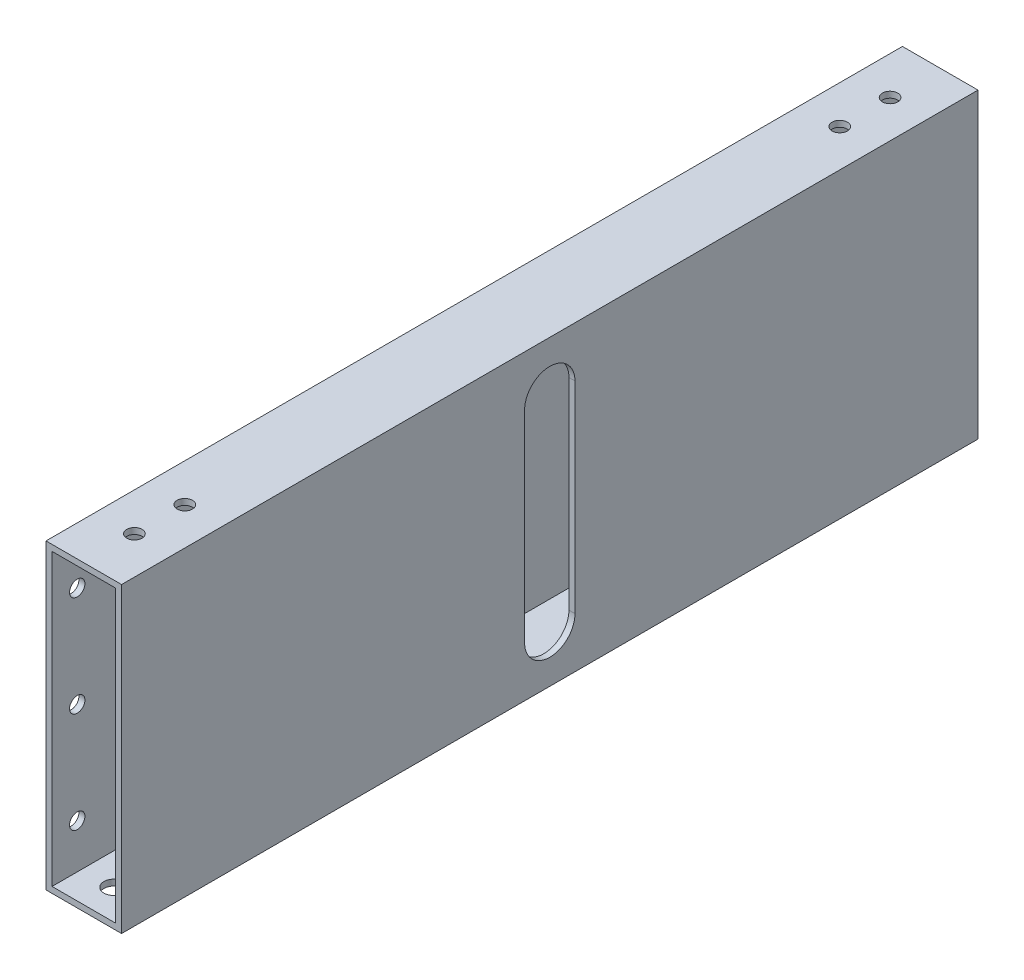
ISO-10303-21;
HEADER;
FILE_DESCRIPTION(('STEP AP214'),'2;1');
FILE_NAME('part.step','',(''),(''),'','','');
FILE_SCHEMA(('AUTOMOTIVE_DESIGN { 1 0 10303 214 1 1 1 1 }'));
ENDSEC;
DATA;
#1=APPLICATION_CONTEXT('core data for automotive mechanical design processes');
#2=APPLICATION_PROTOCOL_DEFINITION('international standard','automotive_design',2000,#1);
#3=PRODUCT_CONTEXT('',#1,'mechanical');
#4=PRODUCT('Part','Part','',(#3));
#5=PRODUCT_RELATED_PRODUCT_CATEGORY('part','',(#4));
#6=PRODUCT_DEFINITION_FORMATION('','',#4);
#7=PRODUCT_DEFINITION_CONTEXT('part definition',#1,'design');
#8=PRODUCT_DEFINITION('design','',#6,#7);
#9=PRODUCT_DEFINITION_SHAPE('','',#8);
#10=(LENGTH_UNIT() NAMED_UNIT(*) SI_UNIT(.MILLI.,.METRE.));
#11=(NAMED_UNIT(*) PLANE_ANGLE_UNIT() SI_UNIT($,.RADIAN.));
#12=(NAMED_UNIT(*) SI_UNIT($,.STERADIAN.) SOLID_ANGLE_UNIT());
#13=UNCERTAINTY_MEASURE_WITH_UNIT(LENGTH_MEASURE(1.E-05),#10,'distance_accuracy_value','');
#14=(GEOMETRIC_REPRESENTATION_CONTEXT(3) GLOBAL_UNCERTAINTY_ASSIGNED_CONTEXT((#13)) GLOBAL_UNIT_ASSIGNED_CONTEXT((#10,
#11,#12)) REPRESENTATION_CONTEXT('',''));
#15=CARTESIAN_POINT('',(0.,0.,0.));
#16=DIRECTION('',(0.,0.,1.));
#17=DIRECTION('',(1.,0.,0.));
#18=AXIS2_PLACEMENT_3D('',#15,#16,#17);
#19=CARTESIAN_POINT('',(0.,0.,85.));
#20=DIRECTION('',(0.,0.,-1.));
#21=DIRECTION('',(-1.,0.,0.));
#22=AXIS2_PLACEMENT_3D('',#19,#20,#21);
#23=PLANE('',#22);
#24=DIRECTION('',(0.,1.,0.));
#25=VECTOR('',#24,1.);
#26=CARTESIAN_POINT('',(7.5,-30.,85.));
#27=LINE('',#26,#25);
#28=CARTESIAN_POINT('',(7.5,-30.,85.));
#29=VERTEX_POINT('',#28);
#30=CARTESIAN_POINT('',(7.5,30.,85.));
#31=VERTEX_POINT('',#30);
#32=EDGE_CURVE('E274',#29,#31,#27,.T.);
#33=ORIENTED_EDGE('',*,*,#32,.T.);
#34=DIRECTION('',(-1.,0.,0.));
#35=VECTOR('',#34,1.);
#36=CARTESIAN_POINT('',(-7.5,30.,85.));
#37=LINE('',#36,#35);
#38=CARTESIAN_POINT('',(-7.5,30.,85.));
#39=VERTEX_POINT('',#38);
#40=EDGE_CURVE('E277',#31,#39,#37,.T.);
#41=ORIENTED_EDGE('',*,*,#40,.T.);
#42=DIRECTION('',(0.,-1.,0.));
#43=VECTOR('',#42,1.);
#44=CARTESIAN_POINT('',(-7.5,-30.,85.));
#45=LINE('',#44,#43);
#46=CARTESIAN_POINT('',(-7.5,-30.,85.));
#47=VERTEX_POINT('',#46);
#48=EDGE_CURVE('E280',#39,#47,#45,.T.);
#49=ORIENTED_EDGE('',*,*,#48,.T.);
#50=DIRECTION('',(1.,0.,0.));
#51=VECTOR('',#50,1.);
#52=CARTESIAN_POINT('',(-7.5,-30.,85.));
#53=LINE('',#52,#51);
#54=EDGE_CURVE('E282',#47,#29,#53,.T.);
#55=ORIENTED_EDGE('',*,*,#54,.T.);
#56=EDGE_LOOP('',(#33,#41,#49,#55));
#57=FACE_BOUND('',#56,.T.);
#58=DIRECTION('',(1.,0.,0.));
#59=VECTOR('',#58,1.);
#60=CARTESIAN_POINT('',(-6.3,-28.8,85.));
#61=LINE('',#60,#59);
#62=CARTESIAN_POINT('',(-6.3,-28.8,85.));
#63=VERTEX_POINT('',#62);
#64=CARTESIAN_POINT('',(6.30000000000001,-28.8,85.));
#65=VERTEX_POINT('',#64);
#66=EDGE_CURVE('E243',#63,#65,#61,.T.);
#67=ORIENTED_EDGE('',*,*,#66,.F.);
#68=DIRECTION('',(0.,-1.,0.));
#69=VECTOR('',#68,1.);
#70=CARTESIAN_POINT('',(-6.3,-28.8,85.));
#71=LINE('',#70,#69);
#72=CARTESIAN_POINT('',(-6.3,28.8,85.));
#73=VERTEX_POINT('',#72);
#74=EDGE_CURVE('E251',#73,#63,#71,.T.);
#75=ORIENTED_EDGE('',*,*,#74,.F.);
#76=DIRECTION('',(-1.,0.,0.));
#77=VECTOR('',#76,1.);
#78=CARTESIAN_POINT('',(-6.3,28.8,85.));
#79=LINE('',#78,#77);
#80=CARTESIAN_POINT('',(6.30000000000001,28.8,85.));
#81=VERTEX_POINT('',#80);
#82=EDGE_CURVE('E248',#81,#73,#79,.T.);
#83=ORIENTED_EDGE('',*,*,#82,.F.);
#84=DIRECTION('',(0.,1.,0.));
#85=VECTOR('',#84,1.);
#86=CARTESIAN_POINT('',(6.30000000000001,-28.8,85.));
#87=LINE('',#86,#85);
#88=EDGE_CURVE('E245',#65,#81,#87,.T.);
#89=ORIENTED_EDGE('',*,*,#88,.F.);
#90=EDGE_LOOP('',(#67,#75,#83,#89));
#91=FACE_BOUND('',#90,.T.);
#92=ADVANCED_FACE('F35',(#57,#91),#23,.F.);
#93=CARTESIAN_POINT('',(0.,0.,-85.));
#94=DIRECTION('',(0.,0.,-1.));
#95=DIRECTION('',(-1.,0.,0.));
#96=AXIS2_PLACEMENT_3D('',#93,#94,#95);
#97=PLANE('',#96);
#98=DIRECTION('',(0.,1.,0.));
#99=VECTOR('',#98,1.);
#100=CARTESIAN_POINT('',(7.5,-30.,-85.));
#101=LINE('',#100,#99);
#102=CARTESIAN_POINT('',(7.5,-30.,-85.));
#103=VERTEX_POINT('',#102);
#104=CARTESIAN_POINT('',(7.5,30.,-85.));
#105=VERTEX_POINT('',#104);
#106=EDGE_CURVE('E273',#103,#105,#101,.T.);
#107=ORIENTED_EDGE('',*,*,#106,.F.);
#108=DIRECTION('',(1.,0.,0.));
#109=VECTOR('',#108,1.);
#110=CARTESIAN_POINT('',(-7.5,-30.,-85.));
#111=LINE('',#110,#109);
#112=CARTESIAN_POINT('',(-7.5,-30.,-85.));
#113=VERTEX_POINT('',#112);
#114=EDGE_CURVE('E278',#113,#103,#111,.T.);
#115=ORIENTED_EDGE('',*,*,#114,.F.);
#116=DIRECTION('',(0.,-1.,0.));
#117=VECTOR('',#116,1.);
#118=CARTESIAN_POINT('',(-7.5,-30.,-85.));
#119=LINE('',#118,#117);
#120=CARTESIAN_POINT('',(-7.5,30.,-85.));
#121=VERTEX_POINT('',#120);
#122=EDGE_CURVE('E289',#121,#113,#119,.T.);
#123=ORIENTED_EDGE('',*,*,#122,.F.);
#124=DIRECTION('',(-1.,0.,0.));
#125=VECTOR('',#124,1.);
#126=CARTESIAN_POINT('',(-7.5,30.,-85.));
#127=LINE('',#126,#125);
#128=EDGE_CURVE('E287',#105,#121,#127,.T.);
#129=ORIENTED_EDGE('',*,*,#128,.F.);
#130=EDGE_LOOP('',(#107,#115,#123,#129));
#131=FACE_BOUND('',#130,.T.);
#132=DIRECTION('',(0.,-1.,0.));
#133=VECTOR('',#132,1.);
#134=CARTESIAN_POINT('',(-6.3,-28.8,-85.));
#135=LINE('',#134,#133);
#136=CARTESIAN_POINT('',(-6.3,28.8,-85.));
#137=VERTEX_POINT('',#136);
#138=CARTESIAN_POINT('',(-6.3,-28.8,-85.));
#139=VERTEX_POINT('',#138);
#140=EDGE_CURVE('E246',#137,#139,#135,.T.);
#141=ORIENTED_EDGE('',*,*,#140,.T.);
#142=DIRECTION('',(1.,0.,0.));
#143=VECTOR('',#142,1.);
#144=CARTESIAN_POINT('',(-6.3,-28.8,-85.));
#145=LINE('',#144,#143);
#146=CARTESIAN_POINT('',(6.30000000000001,-28.8,-85.));
#147=VERTEX_POINT('',#146);
#148=EDGE_CURVE('E242',#139,#147,#145,.T.);
#149=ORIENTED_EDGE('',*,*,#148,.T.);
#150=DIRECTION('',(0.,1.,0.));
#151=VECTOR('',#150,1.);
#152=CARTESIAN_POINT('',(6.30000000000001,-28.8,-85.));
#153=LINE('',#152,#151);
#154=CARTESIAN_POINT('',(6.30000000000001,28.8,-85.));
#155=VERTEX_POINT('',#154);
#156=EDGE_CURVE('E256',#147,#155,#153,.T.);
#157=ORIENTED_EDGE('',*,*,#156,.T.);
#158=DIRECTION('',(-1.,0.,0.));
#159=VECTOR('',#158,1.);
#160=CARTESIAN_POINT('',(-6.3,28.8,-85.));
#161=LINE('',#160,#159);
#162=EDGE_CURVE('E259',#155,#137,#161,.T.);
#163=ORIENTED_EDGE('',*,*,#162,.T.);
#164=EDGE_LOOP('',(#141,#149,#157,#163));
#165=FACE_BOUND('',#164,.T.);
#166=ADVANCED_FACE('F338',(#131,#165),#97,.T.);
#167=CARTESIAN_POINT('',(7.5,-30.,85.));
#168=DIRECTION('',(-1.,0.,0.));
#169=DIRECTION('',(0.,0.,1.));
#170=AXIS2_PLACEMENT_3D('',#167,#168,#169);
#171=PLANE('',#170);
#172=DIRECTION('',(0.,1.,0.));
#173=VECTOR('',#172,1.);
#174=CARTESIAN_POINT('',(7.5,-20.,-5.));
#175=LINE('',#174,#173);
#176=CARTESIAN_POINT('',(7.5,-20.,-5.));
#177=VERTEX_POINT('',#176);
#178=CARTESIAN_POINT('',(7.5,20.,-5.));
#179=VERTEX_POINT('',#178);
#180=EDGE_CURVE('E135',#177,#179,#175,.T.);
#181=ORIENTED_EDGE('',*,*,#180,.F.);
#182=CARTESIAN_POINT('',(7.5,-20.,0.));
#183=DIRECTION('',(1.,0.,0.));
#184=DIRECTION('',(0.,0.,-1.));
#185=AXIS2_PLACEMENT_3D('',#182,#183,#184);
#186=CIRCLE('',#185,5.);
#187=CARTESIAN_POINT('',(7.5,-20.,5.));
#188=VERTEX_POINT('',#187);
#189=EDGE_CURVE('E50',#188,#177,#186,.T.);
#190=ORIENTED_EDGE('',*,*,#189,.F.);
#191=DIRECTION('',(0.,-1.,0.));
#192=VECTOR('',#191,1.);
#193=CARTESIAN_POINT('',(7.5,-20.,5.));
#194=LINE('',#193,#192);
#195=CARTESIAN_POINT('',(7.5,20.,5.00000000000001));
#196=VERTEX_POINT('',#195);
#197=EDGE_CURVE('E141',#196,#188,#194,.T.);
#198=ORIENTED_EDGE('',*,*,#197,.F.);
#199=CARTESIAN_POINT('',(7.5,20.,0.));
#200=DIRECTION('',(1.,0.,0.));
#201=DIRECTION('',(0.,0.,-1.));
#202=AXIS2_PLACEMENT_3D('',#199,#200,#201);
#203=CIRCLE('',#202,5.);
#204=EDGE_CURVE('E126',#179,#196,#203,.T.);
#205=ORIENTED_EDGE('',*,*,#204,.F.);
#206=EDGE_LOOP('',(#181,#190,#198,#205));
#207=FACE_BOUND('',#206,.T.);
#208=ORIENTED_EDGE('',*,*,#106,.T.);
#209=DIRECTION('',(0.,0.,-1.));
#210=VECTOR('',#209,1.);
#211=CARTESIAN_POINT('',(7.5,30.,85.));
#212=LINE('',#211,#210);
#213=EDGE_CURVE('E300',#31,#105,#212,.T.);
#214=ORIENTED_EDGE('',*,*,#213,.F.);
#215=ORIENTED_EDGE('',*,*,#32,.F.);
#216=DIRECTION('',(0.,0.,-1.));
#217=VECTOR('',#216,1.);
#218=CARTESIAN_POINT('',(7.5,-30.,85.));
#219=LINE('',#218,#217);
#220=EDGE_CURVE('E284',#29,#103,#219,.T.);
#221=ORIENTED_EDGE('',*,*,#220,.T.);
#222=EDGE_LOOP('',(#208,#214,#215,#221));
#223=FACE_BOUND('',#222,.T.);
#224=ADVANCED_FACE('F37',(#207,#223),#171,.F.);
#225=CARTESIAN_POINT('',(-7.5,30.,85.));
#226=DIRECTION('',(0.,-1.,0.));
#227=DIRECTION('',(0.,0.,-1.));
#228=AXIS2_PLACEMENT_3D('',#225,#226,#227);
#229=PLANE('',#228);
#230=CARTESIAN_POINT('',(0.0499999999798995,30.,75.0000000000007));
#231=DIRECTION('',(0.,1.,0.));
#232=DIRECTION('',(0.,0.,1.));
#233=AXIS2_PLACEMENT_3D('',#230,#231,#232);
#234=CIRCLE('',#233,1.525);
#235=CARTESIAN_POINT('',(0.0499999999798995,30.,76.5250000000007));
#236=VERTEX_POINT('',#235);
#237=EDGE_CURVE('E205',#236,#236,#234,.T.);
#238=ORIENTED_EDGE('',*,*,#237,.F.);
#239=EDGE_LOOP('',(#238));
#240=FACE_BOUND('',#239,.T.);
#241=CARTESIAN_POINT('',(0.0499999999799064,30.,65.0000000000004));
#242=DIRECTION('',(0.,1.,0.));
#243=DIRECTION('',(0.,0.,1.));
#244=AXIS2_PLACEMENT_3D('',#241,#242,#243);
#245=CIRCLE('',#244,1.525);
#246=CARTESIAN_POINT('',(0.0499999999799064,30.,66.5250000000004));
#247=VERTEX_POINT('',#246);
#248=EDGE_CURVE('E209',#247,#247,#245,.T.);
#249=ORIENTED_EDGE('',*,*,#248,.F.);
#250=EDGE_LOOP('',(#249));
#251=FACE_BOUND('',#250,.T.);
#252=CARTESIAN_POINT('',(0.0499999999799064,30.,-65.0000000000004));
#253=DIRECTION('',(0.,1.,0.));
#254=DIRECTION('',(0.,0.,-1.));
#255=AXIS2_PLACEMENT_3D('',#252,#253,#254);
#256=CIRCLE('',#255,1.525);
#257=CARTESIAN_POINT('',(0.0499999999799064,30.,-66.5250000000004));
#258=VERTEX_POINT('',#257);
#259=EDGE_CURVE('E212',#258,#258,#256,.T.);
#260=ORIENTED_EDGE('',*,*,#259,.F.);
#261=EDGE_LOOP('',(#260));
#262=FACE_BOUND('',#261,.T.);
#263=CARTESIAN_POINT('',(0.0499999999798995,30.,-75.0000000000007));
#264=DIRECTION('',(0.,1.,0.));
#265=DIRECTION('',(0.,0.,-1.));
#266=AXIS2_PLACEMENT_3D('',#263,#264,#265);
#267=CIRCLE('',#266,1.525);
#268=CARTESIAN_POINT('',(0.0499999999798995,30.,-76.5250000000007));
#269=VERTEX_POINT('',#268);
#270=EDGE_CURVE('E204',#269,#269,#267,.T.);
#271=ORIENTED_EDGE('',*,*,#270,.F.);
#272=EDGE_LOOP('',(#271));
#273=FACE_BOUND('',#272,.T.);
#274=ORIENTED_EDGE('',*,*,#128,.T.);
#275=DIRECTION('',(0.,0.,-1.));
#276=VECTOR('',#275,1.);
#277=CARTESIAN_POINT('',(-7.5,30.,85.));
#278=LINE('',#277,#276);
#279=EDGE_CURVE('E297',#39,#121,#278,.T.);
#280=ORIENTED_EDGE('',*,*,#279,.F.);
#281=ORIENTED_EDGE('',*,*,#40,.F.);
#282=ORIENTED_EDGE('',*,*,#213,.T.);
#283=EDGE_LOOP('',(#274,#280,#281,#282));
#284=FACE_BOUND('',#283,.T.);
#285=ADVANCED_FACE('F357',(#240,#251,#262,#273,#284),#229,.F.);
#286=CARTESIAN_POINT('',(-7.5,-30.,85.));
#287=DIRECTION('',(1.,0.,0.));
#288=DIRECTION('',(0.,1.,0.));
#289=AXIS2_PLACEMENT_3D('',#286,#287,#288);
#290=PLANE('',#289);
#291=CARTESIAN_POINT('',(-7.5,0.,0.));
#292=DIRECTION('',(1.,0.,0.));
#293=DIRECTION('',(0.,1.,0.));
#294=AXIS2_PLACEMENT_3D('',#291,#292,#293);
#295=CIRCLE('',#294,1.525);
#296=CARTESIAN_POINT('',(-7.5,1.525,0.));
#297=VERTEX_POINT('',#296);
#298=EDGE_CURVE('E201',#297,#297,#295,.T.);
#299=ORIENTED_EDGE('',*,*,#298,.T.);
#300=EDGE_LOOP('',(#299));
#301=FACE_BOUND('',#300,.T.);
#302=CARTESIAN_POINT('',(-7.5,20.,0.));
#303=DIRECTION('',(1.,0.,0.));
#304=DIRECTION('',(0.,1.,0.));
#305=AXIS2_PLACEMENT_3D('',#302,#303,#304);
#306=CIRCLE('',#305,1.525);
#307=CARTESIAN_POINT('',(-7.5,21.525,0.));
#308=VERTEX_POINT('',#307);
#309=EDGE_CURVE('E198',#308,#308,#306,.T.);
#310=ORIENTED_EDGE('',*,*,#309,.T.);
#311=EDGE_LOOP('',(#310));
#312=FACE_BOUND('',#311,.T.);
#313=CARTESIAN_POINT('',(-7.5,-20.,80.));
#314=DIRECTION('',(1.,0.,0.));
#315=DIRECTION('',(0.,1.,0.));
#316=AXIS2_PLACEMENT_3D('',#313,#314,#315);
#317=CIRCLE('',#316,1.525);
#318=CARTESIAN_POINT('',(-7.5,-18.475,80.));
#319=VERTEX_POINT('',#318);
#320=EDGE_CURVE('E195',#319,#319,#317,.T.);
#321=ORIENTED_EDGE('',*,*,#320,.T.);
#322=EDGE_LOOP('',(#321));
#323=FACE_BOUND('',#322,.T.);
#324=CARTESIAN_POINT('',(-7.5,0.,80.));
#325=DIRECTION('',(1.,0.,0.));
#326=DIRECTION('',(0.,1.,0.));
#327=AXIS2_PLACEMENT_3D('',#324,#325,#326);
#328=CIRCLE('',#327,1.525);
#329=CARTESIAN_POINT('',(-7.5,1.52499999999998,80.));
#330=VERTEX_POINT('',#329);
#331=EDGE_CURVE('E192',#330,#330,#328,.T.);
#332=ORIENTED_EDGE('',*,*,#331,.T.);
#333=EDGE_LOOP('',(#332));
#334=FACE_BOUND('',#333,.T.);
#335=CARTESIAN_POINT('',(-7.5,20.,80.));
#336=DIRECTION('',(1.,0.,0.));
#337=DIRECTION('',(0.,1.,0.));
#338=AXIS2_PLACEMENT_3D('',#335,#336,#337);
#339=CIRCLE('',#338,1.525);
#340=CARTESIAN_POINT('',(-7.5,21.525,80.));
#341=VERTEX_POINT('',#340);
#342=EDGE_CURVE('E189',#341,#341,#339,.T.);
#343=ORIENTED_EDGE('',*,*,#342,.T.);
#344=EDGE_LOOP('',(#343));
#345=FACE_BOUND('',#344,.T.);
#346=CARTESIAN_POINT('',(-7.5,20.,-80.));
#347=DIRECTION('',(1.,0.,0.));
#348=DIRECTION('',(0.,1.,0.));
#349=AXIS2_PLACEMENT_3D('',#346,#347,#348);
#350=CIRCLE('',#349,1.52500000000003);
#351=CARTESIAN_POINT('',(-7.5,21.525,-80.));
#352=VERTEX_POINT('',#351);
#353=EDGE_CURVE('E186',#352,#352,#350,.T.);
#354=ORIENTED_EDGE('',*,*,#353,.T.);
#355=EDGE_LOOP('',(#354));
#356=FACE_BOUND('',#355,.T.);
#357=CARTESIAN_POINT('',(-7.5,0.,-80.));
#358=DIRECTION('',(1.,0.,0.));
#359=DIRECTION('',(0.,1.,0.));
#360=AXIS2_PLACEMENT_3D('',#357,#358,#359);
#361=CIRCLE('',#360,1.52500000000002);
#362=CARTESIAN_POINT('',(-7.5,1.52500000000001,-80.));
#363=VERTEX_POINT('',#362);
#364=EDGE_CURVE('E183',#363,#363,#361,.T.);
#365=ORIENTED_EDGE('',*,*,#364,.T.);
#366=EDGE_LOOP('',(#365));
#367=FACE_BOUND('',#366,.T.);
#368=CARTESIAN_POINT('',(-7.5,-20.,-80.));
#369=DIRECTION('',(1.,0.,0.));
#370=DIRECTION('',(0.,1.,0.));
#371=AXIS2_PLACEMENT_3D('',#368,#369,#370);
#372=CIRCLE('',#371,1.52500000000003);
#373=CARTESIAN_POINT('',(-7.5,-18.475,-80.));
#374=VERTEX_POINT('',#373);
#375=EDGE_CURVE('E180',#374,#374,#372,.T.);
#376=ORIENTED_EDGE('',*,*,#375,.T.);
#377=EDGE_LOOP('',(#376));
#378=FACE_BOUND('',#377,.T.);
#379=CARTESIAN_POINT('',(-7.5,-20.,0.));
#380=DIRECTION('',(1.,0.,0.));
#381=DIRECTION('',(0.,1.,0.));
#382=AXIS2_PLACEMENT_3D('',#379,#380,#381);
#383=CIRCLE('',#382,1.525);
#384=CARTESIAN_POINT('',(-7.5,-18.475,0.));
#385=VERTEX_POINT('',#384);
#386=EDGE_CURVE('E177',#385,#385,#383,.T.);
#387=ORIENTED_EDGE('',*,*,#386,.T.);
#388=EDGE_LOOP('',(#387));
#389=FACE_BOUND('',#388,.T.);
#390=ORIENTED_EDGE('',*,*,#122,.T.);
#391=DIRECTION('',(0.,0.,-1.));
#392=VECTOR('',#391,1.);
#393=CARTESIAN_POINT('',(-7.5,-30.,85.));
#394=LINE('',#393,#392);
#395=EDGE_CURVE('E294',#47,#113,#394,.T.);
#396=ORIENTED_EDGE('',*,*,#395,.F.);
#397=ORIENTED_EDGE('',*,*,#48,.F.);
#398=ORIENTED_EDGE('',*,*,#279,.T.);
#399=EDGE_LOOP('',(#390,#396,#397,#398));
#400=FACE_BOUND('',#399,.T.);
#401=ADVANCED_FACE('F354',(#301,#312,#323,#334,#345,#356,#367,#378,#389,#400),#290,.F.);
#402=CARTESIAN_POINT('',(-7.5,-30.,85.));
#403=DIRECTION('',(0.,1.,0.));
#404=DIRECTION('',(0.,0.,1.));
#405=AXIS2_PLACEMENT_3D('',#402,#403,#404);
#406=PLANE('',#405);
#407=CARTESIAN_POINT('',(0.,-30.,-79.));
#408=DIRECTION('',(0.,1.,0.));
#409=DIRECTION('',(0.,0.,1.));
#410=AXIS2_PLACEMENT_3D('',#407,#408,#409);
#411=CIRCLE('',#410,2.);
#412=CARTESIAN_POINT('',(0.,-30.,-77.));
#413=VERTEX_POINT('',#412);
#414=EDGE_CURVE('E227',#413,#413,#411,.F.);
#415=ORIENTED_EDGE('',*,*,#414,.F.);
#416=EDGE_LOOP('',(#415));
#417=FACE_BOUND('',#416,.T.);
#418=CARTESIAN_POINT('',(0.,-30.,-61.));
#419=DIRECTION('',(0.,1.,0.));
#420=DIRECTION('',(0.,0.,1.));
#421=AXIS2_PLACEMENT_3D('',#418,#419,#420);
#422=CIRCLE('',#421,2.);
#423=CARTESIAN_POINT('',(0.,-30.,-59.));
#424=VERTEX_POINT('',#423);
#425=EDGE_CURVE('E220',#424,#424,#422,.F.);
#426=ORIENTED_EDGE('',*,*,#425,.F.);
#427=EDGE_LOOP('',(#426));
#428=FACE_BOUND('',#427,.T.);
#429=CARTESIAN_POINT('',(0.,-30.,79.));
#430=DIRECTION('',(0.,1.,0.));
#431=DIRECTION('',(0.,0.,1.));
#432=AXIS2_PLACEMENT_3D('',#429,#430,#431);
#433=CIRCLE('',#432,2.);
#434=CARTESIAN_POINT('',(0.,-30.,81.));
#435=VERTEX_POINT('',#434);
#436=EDGE_CURVE('E239',#435,#435,#433,.T.);
#437=ORIENTED_EDGE('',*,*,#436,.T.);
#438=EDGE_LOOP('',(#437));
#439=FACE_BOUND('',#438,.T.);
#440=CARTESIAN_POINT('',(0.,-30.,61.));
#441=DIRECTION('',(0.,1.,0.));
#442=DIRECTION('',(0.,0.,1.));
#443=AXIS2_PLACEMENT_3D('',#440,#441,#442);
#444=CIRCLE('',#443,2.);
#445=CARTESIAN_POINT('',(0.,-30.,63.));
#446=VERTEX_POINT('',#445);
#447=EDGE_CURVE('E234',#446,#446,#444,.T.);
#448=ORIENTED_EDGE('',*,*,#447,.T.);
#449=EDGE_LOOP('',(#448));
#450=FACE_BOUND('',#449,.T.);
#451=ORIENTED_EDGE('',*,*,#114,.T.);
#452=ORIENTED_EDGE('',*,*,#220,.F.);
#453=ORIENTED_EDGE('',*,*,#54,.F.);
#454=ORIENTED_EDGE('',*,*,#395,.T.);
#455=EDGE_LOOP('',(#451,#452,#453,#454));
#456=FACE_BOUND('',#455,.T.);
#457=ADVANCED_FACE('F351',(#417,#428,#439,#450,#456),#406,.F.);
#458=CARTESIAN_POINT('',(-6.3,-28.8,85.));
#459=DIRECTION('',(0.,1.,0.));
#460=DIRECTION('',(0.,0.,1.));
#461=AXIS2_PLACEMENT_3D('',#458,#459,#460);
#462=PLANE('',#461);
#463=CARTESIAN_POINT('',(0.,-28.8,-79.));
#464=DIRECTION('',(0.,-1.,0.));
#465=DIRECTION('',(0.,0.,-1.));
#466=AXIS2_PLACEMENT_3D('',#463,#464,#465);
#467=CIRCLE('',#466,2.);
#468=CARTESIAN_POINT('',(0.,-28.8,-81.));
#469=VERTEX_POINT('',#468);
#470=EDGE_CURVE('E217',#469,#469,#467,.T.);
#471=ORIENTED_EDGE('',*,*,#470,.T.);
#472=EDGE_LOOP('',(#471));
#473=FACE_BOUND('',#472,.T.);
#474=CARTESIAN_POINT('',(0.,-28.8,-61.));
#475=DIRECTION('',(0.,-1.,0.));
#476=DIRECTION('',(0.,0.,-1.));
#477=AXIS2_PLACEMENT_3D('',#474,#475,#476);
#478=CIRCLE('',#477,2.);
#479=CARTESIAN_POINT('',(0.,-28.8,-63.));
#480=VERTEX_POINT('',#479);
#481=EDGE_CURVE('E221',#480,#480,#478,.T.);
#482=ORIENTED_EDGE('',*,*,#481,.T.);
#483=EDGE_LOOP('',(#482));
#484=FACE_BOUND('',#483,.T.);
#485=CARTESIAN_POINT('',(0.,-28.8,79.));
#486=DIRECTION('',(0.,1.,0.));
#487=DIRECTION('',(0.,0.,1.));
#488=AXIS2_PLACEMENT_3D('',#485,#486,#487);
#489=CIRCLE('',#488,2.);
#490=CARTESIAN_POINT('',(0.,-28.8,81.));
#491=VERTEX_POINT('',#490);
#492=EDGE_CURVE('E231',#491,#491,#489,.T.);
#493=ORIENTED_EDGE('',*,*,#492,.F.);
#494=EDGE_LOOP('',(#493));
#495=FACE_BOUND('',#494,.T.);
#496=CARTESIAN_POINT('',(0.,-28.8,61.));
#497=DIRECTION('',(0.,1.,0.));
#498=DIRECTION('',(0.,0.,1.));
#499=AXIS2_PLACEMENT_3D('',#496,#497,#498);
#500=CIRCLE('',#499,2.);
#501=CARTESIAN_POINT('',(0.,-28.8,63.));
#502=VERTEX_POINT('',#501);
#503=EDGE_CURVE('E230',#502,#502,#500,.T.);
#504=ORIENTED_EDGE('',*,*,#503,.F.);
#505=EDGE_LOOP('',(#504));
#506=FACE_BOUND('',#505,.T.);
#507=ORIENTED_EDGE('',*,*,#148,.F.);
#508=DIRECTION('',(0.,0.,-1.));
#509=VECTOR('',#508,1.);
#510=CARTESIAN_POINT('',(-6.3,-28.8,85.));
#511=LINE('',#510,#509);
#512=EDGE_CURVE('E253',#63,#139,#511,.T.);
#513=ORIENTED_EDGE('',*,*,#512,.F.);
#514=ORIENTED_EDGE('',*,*,#66,.T.);
#515=DIRECTION('',(0.,0.,-1.));
#516=VECTOR('',#515,1.);
#517=CARTESIAN_POINT('',(6.30000000000001,-28.8,85.));
#518=LINE('',#517,#516);
#519=EDGE_CURVE('E270',#65,#147,#518,.T.);
#520=ORIENTED_EDGE('',*,*,#519,.T.);
#521=EDGE_LOOP('',(#507,#513,#514,#520));
#522=FACE_BOUND('',#521,.T.);
#523=ADVANCED_FACE('F348',(#473,#484,#495,#506,#522),#462,.T.);
#524=CARTESIAN_POINT('',(6.30000000000001,-28.8,85.));
#525=DIRECTION('',(-1.,0.,0.));
#526=DIRECTION('',(0.,0.,1.));
#527=AXIS2_PLACEMENT_3D('',#524,#525,#526);
#528=PLANE('',#527);
#529=CARTESIAN_POINT('',(6.30000000000001,-20.,0.));
#530=DIRECTION('',(-1.,0.,0.));
#531=DIRECTION('',(0.,0.,1.));
#532=AXIS2_PLACEMENT_3D('',#529,#530,#531);
#533=CIRCLE('',#532,5.);
#534=CARTESIAN_POINT('',(6.30000000000001,-20.,-5.));
#535=VERTEX_POINT('',#534);
#536=CARTESIAN_POINT('',(6.30000000000001,-20.,5.));
#537=VERTEX_POINT('',#536);
#538=EDGE_CURVE('E11',#535,#537,#533,.T.);
#539=ORIENTED_EDGE('',*,*,#538,.F.);
#540=DIRECTION('',(0.,-1.,0.));
#541=VECTOR('',#540,1.);
#542=CARTESIAN_POINT('',(6.30000000000001,-28.8,-5.));
#543=LINE('',#542,#541);
#544=CARTESIAN_POINT('',(6.30000000000001,20.,-5.));
#545=VERTEX_POINT('',#544);
#546=EDGE_CURVE('E303',#545,#535,#543,.T.);
#547=ORIENTED_EDGE('',*,*,#546,.F.);
#548=CARTESIAN_POINT('',(6.30000000000001,20.,0.));
#549=DIRECTION('',(-1.,0.,0.));
#550=DIRECTION('',(0.,0.,1.));
#551=AXIS2_PLACEMENT_3D('',#548,#549,#550);
#552=CIRCLE('',#551,5.);
#553=CARTESIAN_POINT('',(6.30000000000001,20.,5.00000000000001));
#554=VERTEX_POINT('',#553);
#555=EDGE_CURVE('E129',#554,#545,#552,.T.);
#556=ORIENTED_EDGE('',*,*,#555,.F.);
#557=DIRECTION('',(0.,1.,0.));
#558=VECTOR('',#557,1.);
#559=CARTESIAN_POINT('',(6.30000000000001,-28.8,5.));
#560=LINE('',#559,#558);
#561=EDGE_CURVE('E43',#537,#554,#560,.T.);
#562=ORIENTED_EDGE('',*,*,#561,.F.);
#563=EDGE_LOOP('',(#539,#547,#556,#562));
#564=FACE_BOUND('',#563,.T.);
#565=ORIENTED_EDGE('',*,*,#156,.F.);
#566=ORIENTED_EDGE('',*,*,#519,.F.);
#567=ORIENTED_EDGE('',*,*,#88,.T.);
#568=DIRECTION('',(0.,0.,-1.));
#569=VECTOR('',#568,1.);
#570=CARTESIAN_POINT('',(6.30000000000001,28.8,85.));
#571=LINE('',#570,#569);
#572=EDGE_CURVE('E268',#81,#155,#571,.T.);
#573=ORIENTED_EDGE('',*,*,#572,.T.);
#574=EDGE_LOOP('',(#565,#566,#567,#573));
#575=FACE_BOUND('',#574,.T.);
#576=ADVANCED_FACE('F321',(#564,#575),#528,.T.);
#577=CARTESIAN_POINT('',(-6.3,28.8,85.));
#578=DIRECTION('',(0.,-1.,0.));
#579=DIRECTION('',(0.,0.,-1.));
#580=AXIS2_PLACEMENT_3D('',#577,#578,#579);
#581=PLANE('',#580);
#582=CARTESIAN_POINT('',(0.0499999999798995,28.8,75.0000000000007));
#583=DIRECTION('',(0.,-1.,0.));
#584=DIRECTION('',(0.,0.,-1.));
#585=AXIS2_PLACEMENT_3D('',#582,#583,#584);
#586=CIRCLE('',#585,1.525);
#587=CARTESIAN_POINT('',(0.0499999999798995,28.8,73.4750000000007));
#588=VERTEX_POINT('',#587);
#589=EDGE_CURVE('E224',#588,#588,#586,.T.);
#590=ORIENTED_EDGE('',*,*,#589,.F.);
#591=EDGE_LOOP('',(#590));
#592=FACE_BOUND('',#591,.T.);
#593=CARTESIAN_POINT('',(0.0499999999799064,28.8,65.0000000000004));
#594=DIRECTION('',(0.,-1.,0.));
#595=DIRECTION('',(0.,0.,-1.));
#596=AXIS2_PLACEMENT_3D('',#593,#594,#595);
#597=CIRCLE('',#596,1.525);
#598=CARTESIAN_POINT('',(0.0499999999799064,28.8,63.4750000000004));
#599=VERTEX_POINT('',#598);
#600=EDGE_CURVE('E309',#599,#599,#597,.T.);
#601=ORIENTED_EDGE('',*,*,#600,.F.);
#602=EDGE_LOOP('',(#601));
#603=FACE_BOUND('',#602,.T.);
#604=CARTESIAN_POINT('',(0.0499999999799064,28.8,-65.0000000000004));
#605=DIRECTION('',(0.,-1.,0.));
#606=DIRECTION('',(0.,0.,-1.));
#607=AXIS2_PLACEMENT_3D('',#604,#605,#606);
#608=CIRCLE('',#607,1.525);
#609=CARTESIAN_POINT('',(0.0499999999799064,28.8,-66.5250000000004));
#610=VERTEX_POINT('',#609);
#611=EDGE_CURVE('E306',#610,#610,#608,.T.);
#612=ORIENTED_EDGE('',*,*,#611,.F.);
#613=EDGE_LOOP('',(#612));
#614=FACE_BOUND('',#613,.T.);
#615=CARTESIAN_POINT('',(0.0499999999798995,28.8,-75.0000000000007));
#616=DIRECTION('',(0.,-1.,0.));
#617=DIRECTION('',(0.,0.,-1.));
#618=AXIS2_PLACEMENT_3D('',#615,#616,#617);
#619=CIRCLE('',#618,1.525);
#620=CARTESIAN_POINT('',(0.0499999999798995,28.8,-76.5250000000007));
#621=VERTEX_POINT('',#620);
#622=EDGE_CURVE('E208',#621,#621,#619,.T.);
#623=ORIENTED_EDGE('',*,*,#622,.F.);
#624=EDGE_LOOP('',(#623));
#625=FACE_BOUND('',#624,.T.);
#626=ORIENTED_EDGE('',*,*,#162,.F.);
#627=ORIENTED_EDGE('',*,*,#572,.F.);
#628=ORIENTED_EDGE('',*,*,#82,.T.);
#629=DIRECTION('',(0.,0.,-1.));
#630=VECTOR('',#629,1.);
#631=CARTESIAN_POINT('',(-6.3,28.8,85.));
#632=LINE('',#631,#630);
#633=EDGE_CURVE('E266',#73,#137,#632,.T.);
#634=ORIENTED_EDGE('',*,*,#633,.T.);
#635=EDGE_LOOP('',(#626,#627,#628,#634));
#636=FACE_BOUND('',#635,.T.);
#637=ADVANCED_FACE('F400',(#592,#603,#614,#625,#636),#581,.T.);
#638=CARTESIAN_POINT('',(-6.3,-28.8,85.));
#639=DIRECTION('',(1.,0.,0.));
#640=DIRECTION('',(0.,0.,-1.));
#641=AXIS2_PLACEMENT_3D('',#638,#639,#640);
#642=PLANE('',#641);
#643=CARTESIAN_POINT('',(-6.3,0.,0.));
#644=DIRECTION('',(1.,0.,0.));
#645=DIRECTION('',(0.,0.,-1.));
#646=AXIS2_PLACEMENT_3D('',#643,#644,#645);
#647=CIRCLE('',#646,1.525);
#648=CARTESIAN_POINT('',(-6.3,0.,-1.52499999999999));
#649=VERTEX_POINT('',#648);
#650=EDGE_CURVE('E163',#649,#649,#647,.T.);
#651=ORIENTED_EDGE('',*,*,#650,.F.);
#652=EDGE_LOOP('',(#651));
#653=FACE_BOUND('',#652,.T.);
#654=CARTESIAN_POINT('',(-6.3,20.,0.));
#655=DIRECTION('',(1.,0.,0.));
#656=DIRECTION('',(0.,0.,-1.));
#657=AXIS2_PLACEMENT_3D('',#654,#655,#656);
#658=CIRCLE('',#657,1.525);
#659=CARTESIAN_POINT('',(-6.3,20.,-1.52499999999999));
#660=VERTEX_POINT('',#659);
#661=EDGE_CURVE('E167',#660,#660,#658,.T.);
#662=ORIENTED_EDGE('',*,*,#661,.F.);
#663=EDGE_LOOP('',(#662));
#664=FACE_BOUND('',#663,.T.);
#665=CARTESIAN_POINT('',(-6.3,-20.,80.));
#666=DIRECTION('',(1.,0.,0.));
#667=DIRECTION('',(0.,0.,-1.));
#668=AXIS2_PLACEMENT_3D('',#665,#666,#667);
#669=CIRCLE('',#668,1.525);
#670=CARTESIAN_POINT('',(-6.3,-20.,78.475));
#671=VERTEX_POINT('',#670);
#672=EDGE_CURVE('E170',#671,#671,#669,.T.);
#673=ORIENTED_EDGE('',*,*,#672,.F.);
#674=EDGE_LOOP('',(#673));
#675=FACE_BOUND('',#674,.T.);
#676=CARTESIAN_POINT('',(-6.3,0.,80.));
#677=DIRECTION('',(1.,0.,0.));
#678=DIRECTION('',(0.,0.,-1.));
#679=AXIS2_PLACEMENT_3D('',#676,#677,#678);
#680=CIRCLE('',#679,1.525);
#681=CARTESIAN_POINT('',(-6.3,0.,78.475));
#682=VERTEX_POINT('',#681);
#683=EDGE_CURVE('E154',#682,#682,#680,.T.);
#684=ORIENTED_EDGE('',*,*,#683,.F.);
#685=EDGE_LOOP('',(#684));
#686=FACE_BOUND('',#685,.T.);
#687=CARTESIAN_POINT('',(-6.3,20.,80.));
#688=DIRECTION('',(1.,0.,0.));
#689=DIRECTION('',(0.,0.,-1.));
#690=AXIS2_PLACEMENT_3D('',#687,#688,#689);
#691=CIRCLE('',#690,1.525);
#692=CARTESIAN_POINT('',(-6.3,20.,78.475));
#693=VERTEX_POINT('',#692);
#694=EDGE_CURVE('E151',#693,#693,#691,.T.);
#695=ORIENTED_EDGE('',*,*,#694,.F.);
#696=EDGE_LOOP('',(#695));
#697=FACE_BOUND('',#696,.T.);
#698=CARTESIAN_POINT('',(-6.3,20.,-80.));
#699=DIRECTION('',(1.,0.,0.));
#700=DIRECTION('',(0.,0.,1.));
#701=AXIS2_PLACEMENT_3D('',#698,#699,#700);
#702=CIRCLE('',#701,1.52500000000003);
#703=CARTESIAN_POINT('',(-6.3,20.,-78.475));
#704=VERTEX_POINT('',#703);
#705=EDGE_CURVE('E155',#704,#704,#702,.T.);
#706=ORIENTED_EDGE('',*,*,#705,.F.);
#707=EDGE_LOOP('',(#706));
#708=FACE_BOUND('',#707,.T.);
#709=CARTESIAN_POINT('',(-6.3,0.,-80.));
#710=DIRECTION('',(1.,0.,0.));
#711=DIRECTION('',(0.,0.,1.));
#712=AXIS2_PLACEMENT_3D('',#709,#710,#711);
#713=CIRCLE('',#712,1.52500000000002);
#714=CARTESIAN_POINT('',(-6.3,0.,-78.475));
#715=VERTEX_POINT('',#714);
#716=EDGE_CURVE('E158',#715,#715,#713,.T.);
#717=ORIENTED_EDGE('',*,*,#716,.F.);
#718=EDGE_LOOP('',(#717));
#719=FACE_BOUND('',#718,.T.);
#720=CARTESIAN_POINT('',(-6.3,-20.,-80.));
#721=DIRECTION('',(1.,0.,0.));
#722=DIRECTION('',(0.,0.,1.));
#723=AXIS2_PLACEMENT_3D('',#720,#721,#722);
#724=CIRCLE('',#723,1.52500000000003);
#725=CARTESIAN_POINT('',(-6.3,-20.,-78.475));
#726=VERTEX_POINT('',#725);
#727=EDGE_CURVE('E148',#726,#726,#724,.T.);
#728=ORIENTED_EDGE('',*,*,#727,.F.);
#729=EDGE_LOOP('',(#728));
#730=FACE_BOUND('',#729,.T.);
#731=CARTESIAN_POINT('',(-6.3,-20.,0.));
#732=DIRECTION('',(1.,0.,0.));
#733=DIRECTION('',(0.,0.,-1.));
#734=AXIS2_PLACEMENT_3D('',#731,#732,#733);
#735=CIRCLE('',#734,1.525);
#736=CARTESIAN_POINT('',(-6.3,-20.,-1.52499999999999));
#737=VERTEX_POINT('',#736);
#738=EDGE_CURVE('E166',#737,#737,#735,.T.);
#739=ORIENTED_EDGE('',*,*,#738,.F.);
#740=EDGE_LOOP('',(#739));
#741=FACE_BOUND('',#740,.T.);
#742=ORIENTED_EDGE('',*,*,#140,.F.);
#743=ORIENTED_EDGE('',*,*,#633,.F.);
#744=ORIENTED_EDGE('',*,*,#74,.T.);
#745=ORIENTED_EDGE('',*,*,#512,.T.);
#746=EDGE_LOOP('',(#742,#743,#744,#745));
#747=FACE_BOUND('',#746,.T.);
#748=ADVANCED_FACE('F390',(#653,#664,#675,#686,#697,#708,#719,#730,#741,#747),#642,.T.);
#749=CARTESIAN_POINT('',(0.,-38.8,61.));
#750=DIRECTION('',(0.,1.,0.));
#751=DIRECTION('',(0.,0.,1.));
#752=AXIS2_PLACEMENT_3D('',#749,#750,#751);
#753=CYLINDRICAL_SURFACE('',#752,2.);
#754=ORIENTED_EDGE('',*,*,#503,.T.);
#755=EDGE_LOOP('',(#754));
#756=FACE_BOUND('',#755,.T.);
#757=ORIENTED_EDGE('',*,*,#447,.F.);
#758=EDGE_LOOP('',(#757));
#759=FACE_BOUND('',#758,.T.);
#760=ADVANCED_FACE('F407',(#756,#759),#753,.F.);
#761=CARTESIAN_POINT('',(0.,-38.8,79.));
#762=DIRECTION('',(0.,1.,0.));
#763=DIRECTION('',(0.,0.,1.));
#764=AXIS2_PLACEMENT_3D('',#761,#762,#763);
#765=CYLINDRICAL_SURFACE('',#764,2.);
#766=ORIENTED_EDGE('',*,*,#492,.T.);
#767=EDGE_LOOP('',(#766));
#768=FACE_BOUND('',#767,.T.);
#769=ORIENTED_EDGE('',*,*,#436,.F.);
#770=EDGE_LOOP('',(#769));
#771=FACE_BOUND('',#770,.T.);
#772=ADVANCED_FACE('F416',(#768,#771),#765,.F.);
#773=CARTESIAN_POINT('',(0.,-38.8,-61.));
#774=DIRECTION('',(0.,1.,0.));
#775=DIRECTION('',(0.,0.,1.));
#776=AXIS2_PLACEMENT_3D('',#773,#774,#775);
#777=CYLINDRICAL_SURFACE('',#776,2.);
#778=ORIENTED_EDGE('',*,*,#481,.F.);
#779=EDGE_LOOP('',(#778));
#780=FACE_BOUND('',#779,.T.);
#781=ORIENTED_EDGE('',*,*,#425,.T.);
#782=EDGE_LOOP('',(#781));
#783=FACE_BOUND('',#782,.T.);
#784=ADVANCED_FACE('F420',(#780,#783),#777,.F.);
#785=CARTESIAN_POINT('',(0.,-38.8,-79.));
#786=DIRECTION('',(0.,1.,0.));
#787=DIRECTION('',(0.,0.,1.));
#788=AXIS2_PLACEMENT_3D('',#785,#786,#787);
#789=CYLINDRICAL_SURFACE('',#788,2.);
#790=ORIENTED_EDGE('',*,*,#470,.F.);
#791=EDGE_LOOP('',(#790));
#792=FACE_BOUND('',#791,.T.);
#793=ORIENTED_EDGE('',*,*,#414,.T.);
#794=EDGE_LOOP('',(#793));
#795=FACE_BOUND('',#794,.T.);
#796=ADVANCED_FACE('F424',(#792,#795),#789,.F.);
#797=CARTESIAN_POINT('',(0.0499999999798995,20.,-75.0000000000007));
#798=DIRECTION('',(0.,1.,0.));
#799=DIRECTION('',(0.,0.,1.));
#800=AXIS2_PLACEMENT_3D('',#797,#798,#799);
#801=CYLINDRICAL_SURFACE('',#800,1.525);
#802=ORIENTED_EDGE('',*,*,#622,.T.);
#803=EDGE_LOOP('',(#802));
#804=FACE_BOUND('',#803,.T.);
#805=ORIENTED_EDGE('',*,*,#270,.T.);
#806=EDGE_LOOP('',(#805));
#807=FACE_BOUND('',#806,.T.);
#808=ADVANCED_FACE('F428',(#804,#807),#801,.F.);
#809=CARTESIAN_POINT('',(0.0499999999799064,20.,-65.0000000000004));
#810=DIRECTION('',(0.,1.,0.));
#811=DIRECTION('',(0.,0.,1.));
#812=AXIS2_PLACEMENT_3D('',#809,#810,#811);
#813=CYLINDRICAL_SURFACE('',#812,1.525);
#814=ORIENTED_EDGE('',*,*,#611,.T.);
#815=EDGE_LOOP('',(#814));
#816=FACE_BOUND('',#815,.T.);
#817=ORIENTED_EDGE('',*,*,#259,.T.);
#818=EDGE_LOOP('',(#817));
#819=FACE_BOUND('',#818,.T.);
#820=ADVANCED_FACE('F432',(#816,#819),#813,.F.);
#821=CARTESIAN_POINT('',(0.0499999999799064,20.,65.0000000000004));
#822=DIRECTION('',(0.,1.,0.));
#823=DIRECTION('',(0.,0.,1.));
#824=AXIS2_PLACEMENT_3D('',#821,#822,#823);
#825=CYLINDRICAL_SURFACE('',#824,1.525);
#826=ORIENTED_EDGE('',*,*,#600,.T.);
#827=EDGE_LOOP('',(#826));
#828=FACE_BOUND('',#827,.T.);
#829=ORIENTED_EDGE('',*,*,#248,.T.);
#830=EDGE_LOOP('',(#829));
#831=FACE_BOUND('',#830,.T.);
#832=ADVANCED_FACE('F436',(#828,#831),#825,.F.);
#833=CARTESIAN_POINT('',(0.0499999999798995,20.,75.0000000000007));
#834=DIRECTION('',(0.,1.,0.));
#835=DIRECTION('',(0.,0.,1.));
#836=AXIS2_PLACEMENT_3D('',#833,#834,#835);
#837=CYLINDRICAL_SURFACE('',#836,1.525);
#838=ORIENTED_EDGE('',*,*,#589,.T.);
#839=EDGE_LOOP('',(#838));
#840=FACE_BOUND('',#839,.T.);
#841=ORIENTED_EDGE('',*,*,#237,.T.);
#842=EDGE_LOOP('',(#841));
#843=FACE_BOUND('',#842,.T.);
#844=ADVANCED_FACE('F440',(#840,#843),#837,.F.);
#845=CARTESIAN_POINT('',(-16.3,-20.,0.));
#846=DIRECTION('',(1.,0.,0.));
#847=DIRECTION('',(0.,0.,-1.));
#848=AXIS2_PLACEMENT_3D('',#845,#846,#847);
#849=CYLINDRICAL_SURFACE('',#848,1.525);
#850=ORIENTED_EDGE('',*,*,#738,.T.);
#851=EDGE_LOOP('',(#850));
#852=FACE_BOUND('',#851,.T.);
#853=ORIENTED_EDGE('',*,*,#386,.F.);
#854=EDGE_LOOP('',(#853));
#855=FACE_BOUND('',#854,.T.);
#856=ADVANCED_FACE('F444',(#852,#855),#849,.F.);
#857=CARTESIAN_POINT('',(-16.3,-20.,-80.));
#858=DIRECTION('',(1.,0.,0.));
#859=DIRECTION('',(0.,0.,-1.));
#860=AXIS2_PLACEMENT_3D('',#857,#858,#859);
#861=CYLINDRICAL_SURFACE('',#860,1.52500000000003);
#862=ORIENTED_EDGE('',*,*,#727,.T.);
#863=EDGE_LOOP('',(#862));
#864=FACE_BOUND('',#863,.T.);
#865=ORIENTED_EDGE('',*,*,#375,.F.);
#866=EDGE_LOOP('',(#865));
#867=FACE_BOUND('',#866,.T.);
#868=ADVANCED_FACE('F448',(#864,#867),#861,.F.);
#869=CARTESIAN_POINT('',(-16.3,0.,-80.));
#870=DIRECTION('',(1.,0.,0.));
#871=DIRECTION('',(0.,0.,-1.));
#872=AXIS2_PLACEMENT_3D('',#869,#870,#871);
#873=CYLINDRICAL_SURFACE('',#872,1.52500000000002);
#874=ORIENTED_EDGE('',*,*,#716,.T.);
#875=EDGE_LOOP('',(#874));
#876=FACE_BOUND('',#875,.T.);
#877=ORIENTED_EDGE('',*,*,#364,.F.);
#878=EDGE_LOOP('',(#877));
#879=FACE_BOUND('',#878,.T.);
#880=ADVANCED_FACE('F464',(#876,#879),#873,.F.);
#881=CARTESIAN_POINT('',(-16.3,20.,-80.));
#882=DIRECTION('',(1.,0.,0.));
#883=DIRECTION('',(0.,0.,-1.));
#884=AXIS2_PLACEMENT_3D('',#881,#882,#883);
#885=CYLINDRICAL_SURFACE('',#884,1.52500000000003);
#886=ORIENTED_EDGE('',*,*,#705,.T.);
#887=EDGE_LOOP('',(#886));
#888=FACE_BOUND('',#887,.T.);
#889=ORIENTED_EDGE('',*,*,#353,.F.);
#890=EDGE_LOOP('',(#889));
#891=FACE_BOUND('',#890,.T.);
#892=ADVANCED_FACE('F468',(#888,#891),#885,.F.);
#893=CARTESIAN_POINT('',(-16.3,20.,80.));
#894=DIRECTION('',(1.,0.,0.));
#895=DIRECTION('',(0.,0.,-1.));
#896=AXIS2_PLACEMENT_3D('',#893,#894,#895);
#897=CYLINDRICAL_SURFACE('',#896,1.525);
#898=ORIENTED_EDGE('',*,*,#694,.T.);
#899=EDGE_LOOP('',(#898));
#900=FACE_BOUND('',#899,.T.);
#901=ORIENTED_EDGE('',*,*,#342,.F.);
#902=EDGE_LOOP('',(#901));
#903=FACE_BOUND('',#902,.T.);
#904=ADVANCED_FACE('F454',(#900,#903),#897,.F.);
#905=CARTESIAN_POINT('',(-16.3,0.,80.));
#906=DIRECTION('',(1.,0.,0.));
#907=DIRECTION('',(0.,0.,-1.));
#908=AXIS2_PLACEMENT_3D('',#905,#906,#907);
#909=CYLINDRICAL_SURFACE('',#908,1.525);
#910=ORIENTED_EDGE('',*,*,#683,.T.);
#911=EDGE_LOOP('',(#910));
#912=FACE_BOUND('',#911,.T.);
#913=ORIENTED_EDGE('',*,*,#331,.F.);
#914=EDGE_LOOP('',(#913));
#915=FACE_BOUND('',#914,.T.);
#916=ADVANCED_FACE('F450',(#912,#915),#909,.F.);
#917=CARTESIAN_POINT('',(-16.3,-20.,80.));
#918=DIRECTION('',(1.,0.,0.));
#919=DIRECTION('',(0.,0.,-1.));
#920=AXIS2_PLACEMENT_3D('',#917,#918,#919);
#921=CYLINDRICAL_SURFACE('',#920,1.525);
#922=ORIENTED_EDGE('',*,*,#672,.T.);
#923=EDGE_LOOP('',(#922));
#924=FACE_BOUND('',#923,.T.);
#925=ORIENTED_EDGE('',*,*,#320,.F.);
#926=EDGE_LOOP('',(#925));
#927=FACE_BOUND('',#926,.T.);
#928=ADVANCED_FACE('F453',(#924,#927),#921,.F.);
#929=CARTESIAN_POINT('',(-16.3,20.,0.));
#930=DIRECTION('',(1.,0.,0.));
#931=DIRECTION('',(0.,0.,-1.));
#932=AXIS2_PLACEMENT_3D('',#929,#930,#931);
#933=CYLINDRICAL_SURFACE('',#932,1.525);
#934=ORIENTED_EDGE('',*,*,#661,.T.);
#935=EDGE_LOOP('',(#934));
#936=FACE_BOUND('',#935,.T.);
#937=ORIENTED_EDGE('',*,*,#309,.F.);
#938=EDGE_LOOP('',(#937));
#939=FACE_BOUND('',#938,.T.);
#940=ADVANCED_FACE('F332',(#936,#939),#933,.F.);
#941=CARTESIAN_POINT('',(-16.3,0.,0.));
#942=DIRECTION('',(1.,0.,0.));
#943=DIRECTION('',(0.,0.,-1.));
#944=AXIS2_PLACEMENT_3D('',#941,#942,#943);
#945=CYLINDRICAL_SURFACE('',#944,1.525);
#946=ORIENTED_EDGE('',*,*,#650,.T.);
#947=EDGE_LOOP('',(#946));
#948=FACE_BOUND('',#947,.T.);
#949=ORIENTED_EDGE('',*,*,#298,.F.);
#950=EDGE_LOOP('',(#949));
#951=FACE_BOUND('',#950,.T.);
#952=ADVANCED_FACE('F325',(#948,#951),#945,.F.);
#953=CARTESIAN_POINT('',(-2.5,-20.,0.));
#954=DIRECTION('',(1.,0.,0.));
#955=DIRECTION('',(0.,0.,-1.));
#956=AXIS2_PLACEMENT_3D('',#953,#954,#955);
#957=CYLINDRICAL_SURFACE('',#956,5.);
#958=ORIENTED_EDGE('',*,*,#538,.T.);
#959=DIRECTION('',(1.,0.,0.));
#960=VECTOR('',#959,1.);
#961=CARTESIAN_POINT('',(-2.5,-20.,5.));
#962=LINE('',#961,#960);
#963=EDGE_CURVE('E146',#537,#188,#962,.T.);
#964=ORIENTED_EDGE('',*,*,#963,.T.);
#965=ORIENTED_EDGE('',*,*,#189,.T.);
#966=DIRECTION('',(1.,0.,0.));
#967=VECTOR('',#966,1.);
#968=CARTESIAN_POINT('',(-2.5,-20.,-5.));
#969=LINE('',#968,#967);
#970=EDGE_CURVE('E132',#535,#177,#969,.T.);
#971=ORIENTED_EDGE('',*,*,#970,.F.);
#972=EDGE_LOOP('',(#958,#964,#965,#971));
#973=FACE_BOUND('',#972,.T.);
#974=ADVANCED_FACE('F323',(#973),#957,.F.);
#975=CARTESIAN_POINT('',(-2.5,-20.,5.));
#976=DIRECTION('',(0.,0.,1.));
#977=DIRECTION('',(0.,-1.,0.));
#978=AXIS2_PLACEMENT_3D('',#975,#976,#977);
#979=PLANE('',#978);
#980=ORIENTED_EDGE('',*,*,#561,.T.);
#981=DIRECTION('',(1.,0.,0.));
#982=VECTOR('',#981,1.);
#983=CARTESIAN_POINT('',(-2.5,20.,5.00000000000001));
#984=LINE('',#983,#982);
#985=EDGE_CURVE('E131',#554,#196,#984,.T.);
#986=ORIENTED_EDGE('',*,*,#985,.T.);
#987=ORIENTED_EDGE('',*,*,#197,.T.);
#988=ORIENTED_EDGE('',*,*,#963,.F.);
#989=EDGE_LOOP('',(#980,#986,#987,#988));
#990=FACE_BOUND('',#989,.T.);
#991=ADVANCED_FACE('F318',(#990),#979,.F.);
#992=CARTESIAN_POINT('',(-2.5,20.,0.));
#993=DIRECTION('',(1.,0.,0.));
#994=DIRECTION('',(0.,0.,-1.));
#995=AXIS2_PLACEMENT_3D('',#992,#993,#994);
#996=CYLINDRICAL_SURFACE('',#995,5.);
#997=ORIENTED_EDGE('',*,*,#555,.T.);
#998=DIRECTION('',(1.,0.,0.));
#999=VECTOR('',#998,1.);
#1000=CARTESIAN_POINT('',(-2.5,20.,-5.));
#1001=LINE('',#1000,#999);
#1002=EDGE_CURVE('E58',#545,#179,#1001,.T.);
#1003=ORIENTED_EDGE('',*,*,#1002,.T.);
#1004=ORIENTED_EDGE('',*,*,#204,.T.);
#1005=ORIENTED_EDGE('',*,*,#985,.F.);
#1006=EDGE_LOOP('',(#997,#1003,#1004,#1005));
#1007=FACE_BOUND('',#1006,.T.);
#1008=ADVANCED_FACE('F123',(#1007),#996,.F.);
#1009=CARTESIAN_POINT('',(-2.5,-20.,-5.));
#1010=DIRECTION('',(0.,0.,-1.));
#1011=DIRECTION('',(0.,1.,0.));
#1012=AXIS2_PLACEMENT_3D('',#1009,#1010,#1011);
#1013=PLANE('',#1012);
#1014=ORIENTED_EDGE('',*,*,#546,.T.);
#1015=ORIENTED_EDGE('',*,*,#970,.T.);
#1016=ORIENTED_EDGE('',*,*,#180,.T.);
#1017=ORIENTED_EDGE('',*,*,#1002,.F.);
#1018=EDGE_LOOP('',(#1014,#1015,#1016,#1017));
#1019=FACE_BOUND('',#1018,.T.);
#1020=ADVANCED_FACE('F136',(#1019),#1013,.F.);
#1021=CLOSED_SHELL('',(#92,#166,#224,#285,#401,#457,#523,#576,#637,#748,#760,#772,#784,#796,
#808,#820,#832,#844,#856,#868,#880,#892,#904,#916,#928,#940,#952,#974,#991,#1008,#1020));
#1022=MANIFOLD_SOLID_BREP('B2',#1021);
#1023=ADVANCED_BREP_SHAPE_REPRESENTATION('',(#18,#1022),#14);
#1024=SHAPE_DEFINITION_REPRESENTATION(#9,#1023);
ENDSEC;
END-ISO-10303-21;
